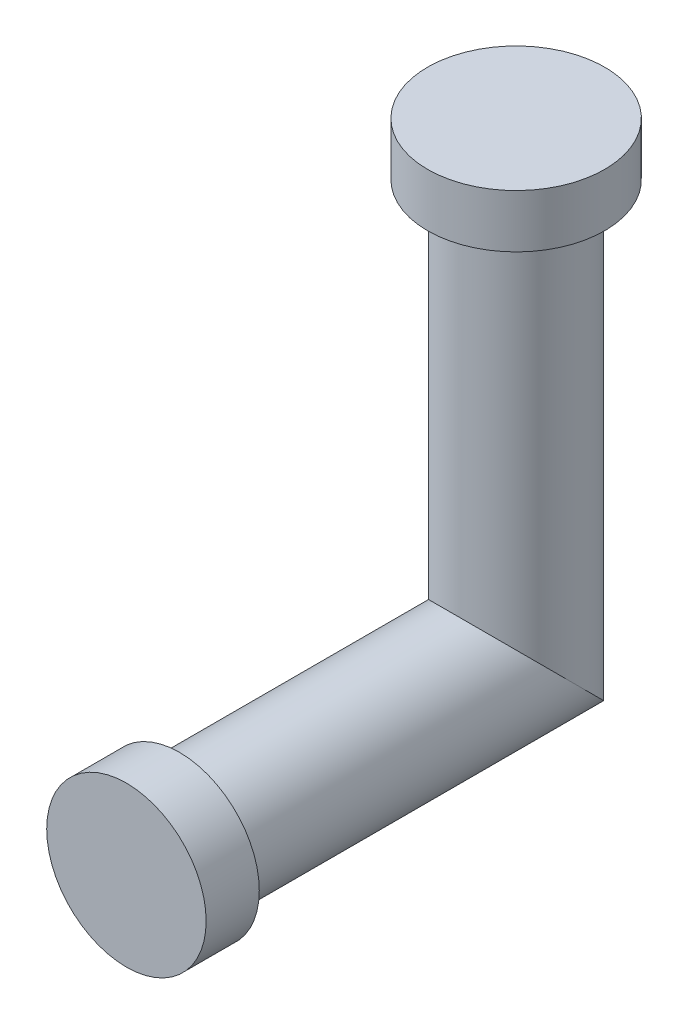
ISO-10303-21;
HEADER;
FILE_DESCRIPTION(('STEP AP214'),'2;1');
FILE_NAME('part.step','',(''),(''),'','','');
FILE_SCHEMA(('AUTOMOTIVE_DESIGN { 1 0 10303 214 1 1 1 1 }'));
ENDSEC;
DATA;
#1=APPLICATION_CONTEXT('core data for automotive mechanical design processes');
#2=APPLICATION_PROTOCOL_DEFINITION('international standard','automotive_design',2000,#1);
#3=PRODUCT_CONTEXT('',#1,'mechanical');
#4=PRODUCT('Part','Part','',(#3));
#5=PRODUCT_RELATED_PRODUCT_CATEGORY('part','',(#4));
#6=PRODUCT_DEFINITION_FORMATION('','',#4);
#7=PRODUCT_DEFINITION_CONTEXT('part definition',#1,'design');
#8=PRODUCT_DEFINITION('design','',#6,#7);
#9=PRODUCT_DEFINITION_SHAPE('','',#8);
#10=(LENGTH_UNIT() NAMED_UNIT(*) SI_UNIT(.MILLI.,.METRE.));
#11=(NAMED_UNIT(*) PLANE_ANGLE_UNIT() SI_UNIT($,.RADIAN.));
#12=(NAMED_UNIT(*) SI_UNIT($,.STERADIAN.) SOLID_ANGLE_UNIT());
#13=UNCERTAINTY_MEASURE_WITH_UNIT(LENGTH_MEASURE(1.E-05),#10,'distance_accuracy_value','');
#14=(GEOMETRIC_REPRESENTATION_CONTEXT(3) GLOBAL_UNCERTAINTY_ASSIGNED_CONTEXT((#13)) GLOBAL_UNIT_ASSIGNED_CONTEXT((#10,
#11,#12)) REPRESENTATION_CONTEXT('',''));
#15=CARTESIAN_POINT('',(0.,0.,0.));
#16=DIRECTION('',(0.,0.,1.));
#17=DIRECTION('',(1.,0.,0.));
#18=AXIS2_PLACEMENT_3D('',#15,#16,#17);
#19=CARTESIAN_POINT('',(-600.,170.,1000.));
#20=DIRECTION('',(0.,0.,-1.));
#21=DIRECTION('',(0.,1.,0.));
#22=AXIS2_PLACEMENT_3D('',#19,#20,#21);
#23=CYLINDRICAL_SURFACE('',#22,35.);
#24=CARTESIAN_POINT('',(-600.,170.,780.));
#25=DIRECTION('',(0.,0.707106781186547,-0.707106781186547));
#26=DIRECTION('',(0.,-0.707106781186548,-0.707106781186548));
#27=AXIS2_PLACEMENT_3D('',#24,#25,#26);
#28=ELLIPSE('',#27,49.4974746830583,35.);
#29=CARTESIAN_POINT('',(-600.,135.,745.));
#30=VERTEX_POINT('',#29);
#31=EDGE_CURVE('E58',#30,#30,#28,.T.);
#32=ORIENTED_EDGE('',*,*,#31,.F.);
#33=EDGE_LOOP('',(#32));
#34=FACE_BOUND('',#33,.T.);
#35=CARTESIAN_POINT('',(-600.,170.,970.));
#36=DIRECTION('',(0.,0.,1.));
#37=DIRECTION('',(1.,0.,0.));
#38=AXIS2_PLACEMENT_3D('',#35,#36,#37);
#39=CIRCLE('',#38,35.);
#40=CARTESIAN_POINT('',(-565.,170.,970.));
#41=VERTEX_POINT('',#40);
#42=EDGE_CURVE('E10',#41,#41,#39,.T.);
#43=ORIENTED_EDGE('',*,*,#42,.F.);
#44=EDGE_LOOP('',(#43));
#45=FACE_BOUND('',#44,.T.);
#46=ADVANCED_FACE('F39',(#34,#45),#23,.T.);
#47=CARTESIAN_POINT('',(-600.,460.,780.));
#48=DIRECTION('',(0.,-1.,0.));
#49=DIRECTION('',(0.,0.,-1.));
#50=AXIS2_PLACEMENT_3D('',#47,#48,#49);
#51=CYLINDRICAL_SURFACE('',#50,35.);
#52=CARTESIAN_POINT('',(-600.,400.,780.));
#53=DIRECTION('',(0.,-1.,0.));
#54=DIRECTION('',(0.,0.,-1.));
#55=AXIS2_PLACEMENT_3D('',#52,#53,#54);
#56=CIRCLE('',#55,35.);
#57=CARTESIAN_POINT('',(-600.,400.,745.));
#58=VERTEX_POINT('',#57);
#59=EDGE_CURVE('E46',#58,#58,#56,.T.);
#60=ORIENTED_EDGE('',*,*,#59,.T.);
#61=EDGE_LOOP('',(#60));
#62=FACE_BOUND('',#61,.T.);
#63=ORIENTED_EDGE('',*,*,#31,.T.);
#64=EDGE_LOOP('',(#63));
#65=FACE_BOUND('',#64,.T.);
#66=ADVANCED_FACE('F41',(#62,#65),#51,.T.);
#67=CARTESIAN_POINT('',(-600.,430.,780.));
#68=DIRECTION('',(0.,-1.,0.));
#69=DIRECTION('',(0.,0.,-1.));
#70=AXIS2_PLACEMENT_3D('',#67,#68,#69);
#71=CYLINDRICAL_SURFACE('',#70,50.);
#72=CARTESIAN_POINT('',(-600.,430.,780.));
#73=DIRECTION('',(0.,1.,0.));
#74=DIRECTION('',(0.,0.,1.));
#75=AXIS2_PLACEMENT_3D('',#72,#73,#74);
#76=CIRCLE('',#75,50.);
#77=CARTESIAN_POINT('',(-600.,430.,830.));
#78=VERTEX_POINT('',#77);
#79=EDGE_CURVE('E50',#78,#78,#76,.T.);
#80=ORIENTED_EDGE('',*,*,#79,.F.);
#81=EDGE_LOOP('',(#80));
#82=FACE_BOUND('',#81,.T.);
#83=CARTESIAN_POINT('',(-600.,400.,780.));
#84=DIRECTION('',(0.,1.,0.));
#85=DIRECTION('',(0.,0.,1.));
#86=AXIS2_PLACEMENT_3D('',#83,#84,#85);
#87=CIRCLE('',#86,50.);
#88=CARTESIAN_POINT('',(-600.,400.,830.));
#89=VERTEX_POINT('',#88);
#90=EDGE_CURVE('E54',#89,#89,#87,.T.);
#91=ORIENTED_EDGE('',*,*,#90,.T.);
#92=EDGE_LOOP('',(#91));
#93=FACE_BOUND('',#92,.T.);
#94=ADVANCED_FACE('F90',(#82,#93),#71,.T.);
#95=CARTESIAN_POINT('',(-600.,430.,780.));
#96=DIRECTION('',(0.,1.,0.));
#97=DIRECTION('',(0.,0.,1.));
#98=AXIS2_PLACEMENT_3D('',#95,#96,#97);
#99=PLANE('',#98);
#100=ORIENTED_EDGE('',*,*,#79,.T.);
#101=EDGE_LOOP('',(#100));
#102=FACE_BOUND('',#101,.T.);
#103=ADVANCED_FACE('F94',(#102),#99,.T.);
#104=CARTESIAN_POINT('',(-600.,400.,780.));
#105=DIRECTION('',(0.,1.,0.));
#106=DIRECTION('',(0.,0.,1.));
#107=AXIS2_PLACEMENT_3D('',#104,#105,#106);
#108=PLANE('',#107);
#109=ORIENTED_EDGE('',*,*,#59,.F.);
#110=EDGE_LOOP('',(#109));
#111=FACE_BOUND('',#110,.T.);
#112=ORIENTED_EDGE('',*,*,#90,.F.);
#113=EDGE_LOOP('',(#112));
#114=FACE_BOUND('',#113,.T.);
#115=ADVANCED_FACE('F82',(#111,#114),#108,.F.);
#116=CARTESIAN_POINT('',(-600.,170.,970.));
#117=DIRECTION('',(0.,0.,1.));
#118=DIRECTION('',(1.,0.,0.));
#119=AXIS2_PLACEMENT_3D('',#116,#117,#118);
#120=CYLINDRICAL_SURFACE('',#119,45.0000000000001);
#121=CARTESIAN_POINT('',(-600.,170.,970.));
#122=DIRECTION('',(0.,0.,1.));
#123=DIRECTION('',(1.,0.,0.));
#124=AXIS2_PLACEMENT_3D('',#121,#122,#123);
#125=CIRCLE('',#124,45.0000000000001);
#126=CARTESIAN_POINT('',(-555.,170.,970.));
#127=VERTEX_POINT('',#126);
#128=EDGE_CURVE('E62',#127,#127,#125,.T.);
#129=ORIENTED_EDGE('',*,*,#128,.T.);
#130=EDGE_LOOP('',(#129));
#131=FACE_BOUND('',#130,.T.);
#132=CARTESIAN_POINT('',(-600.,170.,1000.));
#133=DIRECTION('',(0.,0.,1.));
#134=DIRECTION('',(1.,0.,0.));
#135=AXIS2_PLACEMENT_3D('',#132,#133,#134);
#136=CIRCLE('',#135,45.0000000000001);
#137=CARTESIAN_POINT('',(-555.,170.,1000.));
#138=VERTEX_POINT('',#137);
#139=EDGE_CURVE('E63',#138,#138,#136,.T.);
#140=ORIENTED_EDGE('',*,*,#139,.F.);
#141=EDGE_LOOP('',(#140));
#142=FACE_BOUND('',#141,.T.);
#143=ADVANCED_FACE('F69',(#131,#142),#120,.T.);
#144=CARTESIAN_POINT('',(-600.,170.,970.));
#145=DIRECTION('',(0.,0.,1.));
#146=DIRECTION('',(1.,0.,0.));
#147=AXIS2_PLACEMENT_3D('',#144,#145,#146);
#148=PLANE('',#147);
#149=ORIENTED_EDGE('',*,*,#42,.T.);
#150=EDGE_LOOP('',(#149));
#151=FACE_BOUND('',#150,.T.);
#152=ORIENTED_EDGE('',*,*,#128,.F.);
#153=EDGE_LOOP('',(#152));
#154=FACE_BOUND('',#153,.T.);
#155=ADVANCED_FACE('F72',(#151,#154),#148,.F.);
#156=CARTESIAN_POINT('',(-600.,170.,1000.));
#157=DIRECTION('',(0.,0.,1.));
#158=DIRECTION('',(0.,-1.,0.));
#159=AXIS2_PLACEMENT_3D('',#156,#157,#158);
#160=PLANE('',#159);
#161=ORIENTED_EDGE('',*,*,#139,.T.);
#162=EDGE_LOOP('',(#161));
#163=FACE_BOUND('',#162,.T.);
#164=ADVANCED_FACE('F74',(#163),#160,.T.);
#165=CLOSED_SHELL('',(#46,#66,#94,#103,#115,#143,#155,#164));
#166=MANIFOLD_SOLID_BREP('B2',#165);
#167=ADVANCED_BREP_SHAPE_REPRESENTATION('',(#18,#166),#14);
#168=SHAPE_DEFINITION_REPRESENTATION(#9,#167);
ENDSEC;
END-ISO-10303-21;
